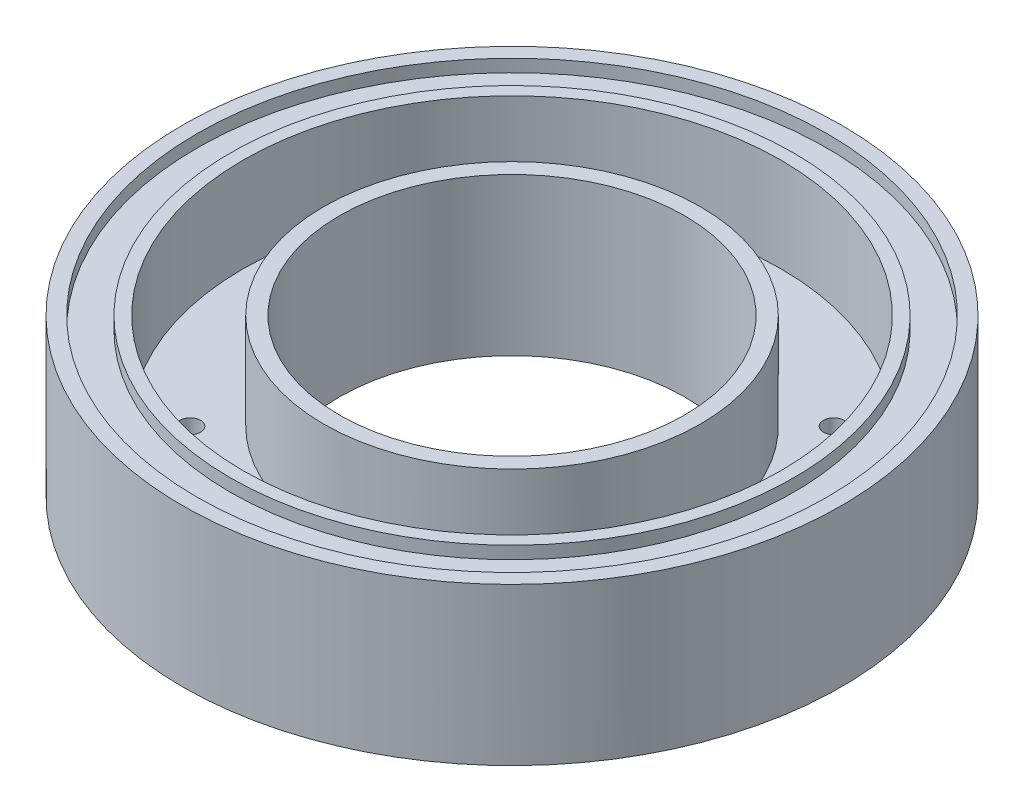
ISO-10303-21;
HEADER;
FILE_DESCRIPTION(('STEP AP214'),'2;1');
FILE_NAME('part.step','',(''),(''),'','','');
FILE_SCHEMA(('AUTOMOTIVE_DESIGN { 1 0 10303 214 1 1 1 1 }'));
ENDSEC;
DATA;
#1=APPLICATION_CONTEXT('core data for automotive mechanical design processes');
#2=APPLICATION_PROTOCOL_DEFINITION('international standard','automotive_design',2000,#1);
#3=PRODUCT_CONTEXT('',#1,'mechanical');
#4=PRODUCT('Part','Part','',(#3));
#5=PRODUCT_RELATED_PRODUCT_CATEGORY('part','',(#4));
#6=PRODUCT_DEFINITION_FORMATION('','',#4);
#7=PRODUCT_DEFINITION_CONTEXT('part definition',#1,'design');
#8=PRODUCT_DEFINITION('design','',#6,#7);
#9=PRODUCT_DEFINITION_SHAPE('','',#8);
#10=(LENGTH_UNIT() NAMED_UNIT(*) SI_UNIT(.MILLI.,.METRE.));
#11=(NAMED_UNIT(*) PLANE_ANGLE_UNIT() SI_UNIT($,.RADIAN.));
#12=(NAMED_UNIT(*) SI_UNIT($,.STERADIAN.) SOLID_ANGLE_UNIT());
#13=UNCERTAINTY_MEASURE_WITH_UNIT(LENGTH_MEASURE(1.E-05),#10,'distance_accuracy_value','');
#14=(GEOMETRIC_REPRESENTATION_CONTEXT(3) GLOBAL_UNCERTAINTY_ASSIGNED_CONTEXT((#13)) GLOBAL_UNIT_ASSIGNED_CONTEXT((#10,
#11,#12)) REPRESENTATION_CONTEXT('',''));
#15=CARTESIAN_POINT('',(0.,0.,0.));
#16=DIRECTION('',(0.,0.,1.));
#17=DIRECTION('',(1.,0.,0.));
#18=AXIS2_PLACEMENT_3D('',#15,#16,#17);
#19=CARTESIAN_POINT('',(-25.635,10.,25.635));
#20=DIRECTION('',(0.,-1.,0.));
#21=DIRECTION('',(0.,0.,-1.));
#22=AXIS2_PLACEMENT_3D('',#19,#20,#21);
#23=CYLINDRICAL_SURFACE('',#22,1.65);
#24=CARTESIAN_POINT('',(-25.635,4.,25.635));
#25=DIRECTION('',(0.,-1.,0.));
#26=DIRECTION('',(0.,0.,-1.));
#27=AXIS2_PLACEMENT_3D('',#24,#25,#26);
#28=CIRCLE('',#27,1.65);
#29=CARTESIAN_POINT('',(-25.635,4.,23.985));
#30=VERTEX_POINT('',#29);
#31=EDGE_CURVE('E115',#30,#30,#28,.F.);
#32=ORIENTED_EDGE('',*,*,#31,.F.);
#33=EDGE_LOOP('',(#32));
#34=FACE_BOUND('',#33,.T.);
#35=CARTESIAN_POINT('',(-25.635,9.7,25.635));
#36=DIRECTION('',(0.,1.,0.));
#37=DIRECTION('',(0.,0.,1.));
#38=AXIS2_PLACEMENT_3D('',#35,#36,#37);
#39=CIRCLE('',#38,1.65);
#40=CARTESIAN_POINT('',(-25.635,9.7,27.285));
#41=VERTEX_POINT('',#40);
#42=EDGE_CURVE('E68',#41,#41,#39,.F.);
#43=ORIENTED_EDGE('',*,*,#42,.F.);
#44=EDGE_LOOP('',(#43));
#45=FACE_BOUND('',#44,.T.);
#46=ADVANCED_FACE('F35',(#34,#45),#23,.F.);
#47=CARTESIAN_POINT('',(25.635,10.,25.635));
#48=DIRECTION('',(0.,-1.,0.));
#49=DIRECTION('',(0.,0.,-1.));
#50=AXIS2_PLACEMENT_3D('',#47,#48,#49);
#51=CYLINDRICAL_SURFACE('',#50,1.65);
#52=CARTESIAN_POINT('',(25.635,4.,25.635));
#53=DIRECTION('',(0.,-1.,0.));
#54=DIRECTION('',(0.,0.,-1.));
#55=AXIS2_PLACEMENT_3D('',#52,#53,#54);
#56=CIRCLE('',#55,1.65);
#57=CARTESIAN_POINT('',(25.635,4.,23.985));
#58=VERTEX_POINT('',#57);
#59=EDGE_CURVE('E127',#58,#58,#56,.F.);
#60=ORIENTED_EDGE('',*,*,#59,.F.);
#61=EDGE_LOOP('',(#60));
#62=FACE_BOUND('',#61,.T.);
#63=CARTESIAN_POINT('',(25.635,9.7,25.635));
#64=DIRECTION('',(0.,1.,0.));
#65=DIRECTION('',(0.,0.,1.));
#66=AXIS2_PLACEMENT_3D('',#63,#64,#65);
#67=CIRCLE('',#66,1.65);
#68=CARTESIAN_POINT('',(25.635,9.7,27.285));
#69=VERTEX_POINT('',#68);
#70=EDGE_CURVE('E65',#69,#69,#67,.F.);
#71=ORIENTED_EDGE('',*,*,#70,.F.);
#72=EDGE_LOOP('',(#71));
#73=FACE_BOUND('',#72,.T.);
#74=ADVANCED_FACE('F160',(#62,#73),#51,.F.);
#75=CARTESIAN_POINT('',(25.635,10.,-25.635));
#76=DIRECTION('',(0.,-1.,0.));
#77=DIRECTION('',(0.,0.,-1.));
#78=AXIS2_PLACEMENT_3D('',#75,#76,#77);
#79=CYLINDRICAL_SURFACE('',#78,1.65);
#80=CARTESIAN_POINT('',(25.635,4.,-25.635));
#81=DIRECTION('',(0.,-1.,0.));
#82=DIRECTION('',(0.,0.,-1.));
#83=AXIS2_PLACEMENT_3D('',#80,#81,#82);
#84=CIRCLE('',#83,1.65);
#85=CARTESIAN_POINT('',(25.635,4.,-27.285));
#86=VERTEX_POINT('',#85);
#87=EDGE_CURVE('E124',#86,#86,#84,.F.);
#88=ORIENTED_EDGE('',*,*,#87,.F.);
#89=EDGE_LOOP('',(#88));
#90=FACE_BOUND('',#89,.T.);
#91=CARTESIAN_POINT('',(25.635,9.7,-25.635));
#92=DIRECTION('',(0.,1.,0.));
#93=DIRECTION('',(0.,0.,1.));
#94=AXIS2_PLACEMENT_3D('',#91,#92,#93);
#95=CIRCLE('',#94,1.65);
#96=CARTESIAN_POINT('',(25.635,9.7,-23.985));
#97=VERTEX_POINT('',#96);
#98=EDGE_CURVE('E62',#97,#97,#95,.F.);
#99=ORIENTED_EDGE('',*,*,#98,.F.);
#100=EDGE_LOOP('',(#99));
#101=FACE_BOUND('',#100,.T.);
#102=ADVANCED_FACE('F166',(#90,#101),#79,.F.);
#103=CARTESIAN_POINT('',(-25.635,10.,-25.635));
#104=DIRECTION('',(0.,-1.,0.));
#105=DIRECTION('',(0.,0.,-1.));
#106=AXIS2_PLACEMENT_3D('',#103,#104,#105);
#107=CYLINDRICAL_SURFACE('',#106,1.65);
#108=CARTESIAN_POINT('',(-25.635,4.,-25.635));
#109=DIRECTION('',(0.,-1.,0.));
#110=DIRECTION('',(0.,0.,-1.));
#111=AXIS2_PLACEMENT_3D('',#108,#109,#110);
#112=CIRCLE('',#111,1.65);
#113=CARTESIAN_POINT('',(-25.635,4.,-27.285));
#114=VERTEX_POINT('',#113);
#115=EDGE_CURVE('E109',#114,#114,#112,.F.);
#116=ORIENTED_EDGE('',*,*,#115,.F.);
#117=EDGE_LOOP('',(#116));
#118=FACE_BOUND('',#117,.T.);
#119=CARTESIAN_POINT('',(-25.635,9.7,-25.635));
#120=DIRECTION('',(0.,1.,0.));
#121=DIRECTION('',(0.,0.,1.));
#122=AXIS2_PLACEMENT_3D('',#119,#120,#121);
#123=CIRCLE('',#122,1.65);
#124=CARTESIAN_POINT('',(-25.635,9.7,-23.985));
#125=VERTEX_POINT('',#124);
#126=EDGE_CURVE('E39',#125,#125,#123,.F.);
#127=ORIENTED_EDGE('',*,*,#126,.F.);
#128=EDGE_LOOP('',(#127));
#129=FACE_BOUND('',#128,.T.);
#130=ADVANCED_FACE('F173',(#118,#129),#107,.F.);
#131=CARTESIAN_POINT('',(0.,30.,0.));
#132=DIRECTION('',(0.,-1.,0.));
#133=DIRECTION('',(0.,0.,-1.));
#134=AXIS2_PLACEMENT_3D('',#131,#132,#133);
#135=CYLINDRICAL_SURFACE('',#134,52.5);
#136=CARTESIAN_POINT('',(0.,25.,0.));
#137=DIRECTION('',(0.,-1.,0.));
#138=DIRECTION('',(0.,0.,-1.));
#139=AXIS2_PLACEMENT_3D('',#136,#137,#138);
#140=CIRCLE('',#139,52.5);
#141=CARTESIAN_POINT('',(0.,25.,-52.5));
#142=VERTEX_POINT('',#141);
#143=EDGE_CURVE('E84',#142,#142,#140,.T.);
#144=ORIENTED_EDGE('',*,*,#143,.T.);
#145=EDGE_LOOP('',(#144));
#146=FACE_BOUND('',#145,.T.);
#147=CARTESIAN_POINT('',(0.,0.,0.));
#148=DIRECTION('',(0.,1.,0.));
#149=DIRECTION('',(0.,0.,1.));
#150=AXIS2_PLACEMENT_3D('',#147,#148,#149);
#151=CIRCLE('',#150,52.5);
#152=CARTESIAN_POINT('',(0.,0.,52.5));
#153=VERTEX_POINT('',#152);
#154=EDGE_CURVE('E11',#153,#153,#151,.T.);
#155=ORIENTED_EDGE('',*,*,#154,.T.);
#156=EDGE_LOOP('',(#155));
#157=FACE_BOUND('',#156,.T.);
#158=ADVANCED_FACE('F37',(#146,#157),#135,.T.);
#159=CARTESIAN_POINT('',(0.,0.,0.));
#160=DIRECTION('',(0.,1.,0.));
#161=DIRECTION('',(0.,0.,1.));
#162=AXIS2_PLACEMENT_3D('',#159,#160,#161);
#163=PLANE('',#162);
#164=CARTESIAN_POINT('',(-25.635,0.,-25.635));
#165=DIRECTION('',(0.,-1.,0.));
#166=DIRECTION('',(0.,0.,-1.));
#167=AXIS2_PLACEMENT_3D('',#164,#165,#166);
#168=CIRCLE('',#167,3.);
#169=CARTESIAN_POINT('',(-25.635,0.,-28.635));
#170=VERTEX_POINT('',#169);
#171=EDGE_CURVE('E87',#170,#170,#168,.T.);
#172=ORIENTED_EDGE('',*,*,#171,.F.);
#173=EDGE_LOOP('',(#172));
#174=FACE_BOUND('',#173,.T.);
#175=CARTESIAN_POINT('',(25.635,0.,-25.635));
#176=DIRECTION('',(0.,-1.,0.));
#177=DIRECTION('',(0.,0.,-1.));
#178=AXIS2_PLACEMENT_3D('',#175,#176,#177);
#179=CIRCLE('',#178,3.);
#180=CARTESIAN_POINT('',(25.635,0.,-28.635));
#181=VERTEX_POINT('',#180);
#182=EDGE_CURVE('E98',#181,#181,#179,.T.);
#183=ORIENTED_EDGE('',*,*,#182,.F.);
#184=EDGE_LOOP('',(#183));
#185=FACE_BOUND('',#184,.T.);
#186=CARTESIAN_POINT('',(25.635,0.,25.635));
#187=DIRECTION('',(0.,-1.,0.));
#188=DIRECTION('',(0.,0.,-1.));
#189=AXIS2_PLACEMENT_3D('',#186,#187,#188);
#190=CIRCLE('',#189,3.);
#191=CARTESIAN_POINT('',(25.635,0.,22.635));
#192=VERTEX_POINT('',#191);
#193=EDGE_CURVE('E92',#192,#192,#190,.T.);
#194=ORIENTED_EDGE('',*,*,#193,.F.);
#195=EDGE_LOOP('',(#194));
#196=FACE_BOUND('',#195,.T.);
#197=CARTESIAN_POINT('',(-25.635,0.,25.635));
#198=DIRECTION('',(0.,-1.,0.));
#199=DIRECTION('',(0.,0.,-1.));
#200=AXIS2_PLACEMENT_3D('',#197,#198,#199);
#201=CIRCLE('',#200,3.);
#202=CARTESIAN_POINT('',(-25.635,0.,22.635));
#203=VERTEX_POINT('',#202);
#204=EDGE_CURVE('E91',#203,#203,#201,.T.);
#205=ORIENTED_EDGE('',*,*,#204,.F.);
#206=EDGE_LOOP('',(#205));
#207=FACE_BOUND('',#206,.T.);
#208=CARTESIAN_POINT('',(0.,0.,0.));
#209=DIRECTION('',(0.,1.,0.));
#210=DIRECTION('',(0.,0.,1.));
#211=AXIS2_PLACEMENT_3D('',#208,#209,#210);
#212=CIRCLE('',#211,27.5);
#213=CARTESIAN_POINT('',(0.,0.,27.5));
#214=VERTEX_POINT('',#213);
#215=EDGE_CURVE('E112',#214,#214,#212,.T.);
#216=ORIENTED_EDGE('',*,*,#215,.T.);
#217=EDGE_LOOP('',(#216));
#218=FACE_BOUND('',#217,.T.);
#219=ORIENTED_EDGE('',*,*,#154,.F.);
#220=EDGE_LOOP('',(#219));
#221=FACE_BOUND('',#220,.T.);
#222=ADVANCED_FACE('F185',(#174,#185,#196,#207,#218,#221),#163,.F.);
#223=CARTESIAN_POINT('',(0.,10.,0.));
#224=DIRECTION('',(0.,1.,0.));
#225=DIRECTION('',(0.,0.,1.));
#226=AXIS2_PLACEMENT_3D('',#223,#224,#225);
#227=CYLINDRICAL_SURFACE('',#226,42.85);
#228=CARTESIAN_POINT('',(0.,25.,0.));
#229=DIRECTION('',(0.,-1.,0.));
#230=DIRECTION('',(0.,0.,-1.));
#231=AXIS2_PLACEMENT_3D('',#228,#229,#230);
#232=CIRCLE('',#231,42.85);
#233=CARTESIAN_POINT('',(0.,25.,-42.85));
#234=VERTEX_POINT('',#233);
#235=EDGE_CURVE('E75',#234,#234,#232,.F.);
#236=ORIENTED_EDGE('',*,*,#235,.T.);
#237=EDGE_LOOP('',(#236));
#238=FACE_BOUND('',#237,.T.);
#239=CARTESIAN_POINT('',(0.,10.,0.));
#240=DIRECTION('',(0.,1.,0.));
#241=DIRECTION('',(0.,0.,1.));
#242=AXIS2_PLACEMENT_3D('',#239,#240,#241);
#243=CIRCLE('',#242,42.85);
#244=CARTESIAN_POINT('',(42.85,10.,0.));
#245=VERTEX_POINT('',#244);
#246=EDGE_CURVE('E52',#245,#245,#243,.T.);
#247=ORIENTED_EDGE('',*,*,#246,.F.);
#248=EDGE_LOOP('',(#247));
#249=FACE_BOUND('',#248,.T.);
#250=ADVANCED_FACE('F181',(#238,#249),#227,.F.);
#251=CARTESIAN_POINT('',(0.,10.,0.));
#252=DIRECTION('',(0.,1.,0.));
#253=DIRECTION('',(0.,0.,1.));
#254=AXIS2_PLACEMENT_3D('',#251,#252,#253);
#255=CYLINDRICAL_SURFACE('',#254,30.);
#256=CARTESIAN_POINT('',(0.,25.,0.));
#257=DIRECTION('',(0.,-1.,0.));
#258=DIRECTION('',(0.,0.,-1.));
#259=AXIS2_PLACEMENT_3D('',#256,#257,#258);
#260=CIRCLE('',#259,30.);
#261=CARTESIAN_POINT('',(0.,25.,-30.));
#262=VERTEX_POINT('',#261);
#263=EDGE_CURVE('E72',#262,#262,#260,.F.);
#264=ORIENTED_EDGE('',*,*,#263,.F.);
#265=EDGE_LOOP('',(#264));
#266=FACE_BOUND('',#265,.T.);
#267=CARTESIAN_POINT('',(0.,9.7,0.));
#268=DIRECTION('',(0.,1.,0.));
#269=DIRECTION('',(0.,0.,1.));
#270=AXIS2_PLACEMENT_3D('',#267,#268,#269);
#271=CIRCLE('',#270,30.);
#272=CARTESIAN_POINT('',(0.,9.7,30.));
#273=VERTEX_POINT('',#272);
#274=EDGE_CURVE('E55',#273,#273,#271,.T.);
#275=ORIENTED_EDGE('',*,*,#274,.T.);
#276=EDGE_LOOP('',(#275));
#277=FACE_BOUND('',#276,.T.);
#278=ADVANCED_FACE('F178',(#266,#277),#255,.T.);
#279=CARTESIAN_POINT('',(0.,0.,0.));
#280=DIRECTION('',(0.,1.,0.));
#281=DIRECTION('',(0.,0.,1.));
#282=AXIS2_PLACEMENT_3D('',#279,#280,#281);
#283=CYLINDRICAL_SURFACE('',#282,27.5);
#284=CARTESIAN_POINT('',(0.,25.,0.));
#285=DIRECTION('',(0.,-1.,0.));
#286=DIRECTION('',(0.,0.,-1.));
#287=AXIS2_PLACEMENT_3D('',#284,#285,#286);
#288=CIRCLE('',#287,27.5);
#289=CARTESIAN_POINT('',(0.,25.,-27.5));
#290=VERTEX_POINT('',#289);
#291=EDGE_CURVE('E71',#290,#290,#288,.F.);
#292=ORIENTED_EDGE('',*,*,#291,.T.);
#293=EDGE_LOOP('',(#292));
#294=FACE_BOUND('',#293,.T.);
#295=ORIENTED_EDGE('',*,*,#215,.F.);
#296=EDGE_LOOP('',(#295));
#297=FACE_BOUND('',#296,.T.);
#298=ADVANCED_FACE('F134',(#294,#297),#283,.F.);
#299=CARTESIAN_POINT('',(-25.635,4.,-25.635));
#300=DIRECTION('',(0.,-1.,0.));
#301=DIRECTION('',(0.,0.,-1.));
#302=AXIS2_PLACEMENT_3D('',#299,#300,#301);
#303=PLANE('',#302);
#304=CARTESIAN_POINT('',(-25.635,4.,-25.635));
#305=DIRECTION('',(0.,-1.,0.));
#306=DIRECTION('',(0.,0.,-1.));
#307=AXIS2_PLACEMENT_3D('',#304,#305,#306);
#308=CIRCLE('',#307,3.);
#309=CARTESIAN_POINT('',(-25.635,4.,-28.635));
#310=VERTEX_POINT('',#309);
#311=EDGE_CURVE('E101',#310,#310,#308,.T.);
#312=ORIENTED_EDGE('',*,*,#311,.T.);
#313=EDGE_LOOP('',(#312));
#314=FACE_BOUND('',#313,.T.);
#315=ORIENTED_EDGE('',*,*,#115,.T.);
#316=EDGE_LOOP('',(#315));
#317=FACE_BOUND('',#316,.T.);
#318=ADVANCED_FACE('F177',(#314,#317),#303,.T.);
#319=CARTESIAN_POINT('',(-25.635,4.,-25.635));
#320=DIRECTION('',(0.,-1.,0.));
#321=DIRECTION('',(0.,0.,-1.));
#322=AXIS2_PLACEMENT_3D('',#319,#320,#321);
#323=CYLINDRICAL_SURFACE('',#322,3.);
#324=ORIENTED_EDGE('',*,*,#311,.F.);
#325=EDGE_LOOP('',(#324));
#326=FACE_BOUND('',#325,.T.);
#327=ORIENTED_EDGE('',*,*,#171,.T.);
#328=EDGE_LOOP('',(#327));
#329=FACE_BOUND('',#328,.T.);
#330=ADVANCED_FACE('F234',(#326,#329),#323,.F.);
#331=CARTESIAN_POINT('',(25.635,4.,-25.635));
#332=DIRECTION('',(0.,-1.,0.));
#333=DIRECTION('',(0.,0.,-1.));
#334=AXIS2_PLACEMENT_3D('',#331,#332,#333);
#335=PLANE('',#334);
#336=CARTESIAN_POINT('',(25.635,4.,-25.635));
#337=DIRECTION('',(0.,-1.,0.));
#338=DIRECTION('',(0.,0.,-1.));
#339=AXIS2_PLACEMENT_3D('',#336,#337,#338);
#340=CIRCLE('',#339,3.);
#341=CARTESIAN_POINT('',(25.635,4.,-28.635));
#342=VERTEX_POINT('',#341);
#343=EDGE_CURVE('E95',#342,#342,#340,.T.);
#344=ORIENTED_EDGE('',*,*,#343,.T.);
#345=EDGE_LOOP('',(#344));
#346=FACE_BOUND('',#345,.T.);
#347=ORIENTED_EDGE('',*,*,#87,.T.);
#348=EDGE_LOOP('',(#347));
#349=FACE_BOUND('',#348,.T.);
#350=ADVANCED_FACE('F231',(#346,#349),#335,.T.);
#351=CARTESIAN_POINT('',(25.635,4.,-25.635));
#352=DIRECTION('',(0.,-1.,0.));
#353=DIRECTION('',(0.,0.,-1.));
#354=AXIS2_PLACEMENT_3D('',#351,#352,#353);
#355=CYLINDRICAL_SURFACE('',#354,3.);
#356=ORIENTED_EDGE('',*,*,#343,.F.);
#357=EDGE_LOOP('',(#356));
#358=FACE_BOUND('',#357,.T.);
#359=ORIENTED_EDGE('',*,*,#182,.T.);
#360=EDGE_LOOP('',(#359));
#361=FACE_BOUND('',#360,.T.);
#362=ADVANCED_FACE('F227',(#358,#361),#355,.F.);
#363=CARTESIAN_POINT('',(25.635,4.,25.635));
#364=DIRECTION('',(0.,-1.,0.));
#365=DIRECTION('',(0.,0.,-1.));
#366=AXIS2_PLACEMENT_3D('',#363,#364,#365);
#367=PLANE('',#366);
#368=CARTESIAN_POINT('',(25.635,4.,25.635));
#369=DIRECTION('',(0.,-1.,0.));
#370=DIRECTION('',(0.,0.,-1.));
#371=AXIS2_PLACEMENT_3D('',#368,#369,#370);
#372=CIRCLE('',#371,3.);
#373=CARTESIAN_POINT('',(25.635,4.,22.635));
#374=VERTEX_POINT('',#373);
#375=EDGE_CURVE('E88',#374,#374,#372,.T.);
#376=ORIENTED_EDGE('',*,*,#375,.T.);
#377=EDGE_LOOP('',(#376));
#378=FACE_BOUND('',#377,.T.);
#379=ORIENTED_EDGE('',*,*,#59,.T.);
#380=EDGE_LOOP('',(#379));
#381=FACE_BOUND('',#380,.T.);
#382=ADVANCED_FACE('F218',(#378,#381),#367,.T.);
#383=CARTESIAN_POINT('',(25.635,4.,25.635));
#384=DIRECTION('',(0.,-1.,0.));
#385=DIRECTION('',(0.,0.,-1.));
#386=AXIS2_PLACEMENT_3D('',#383,#384,#385);
#387=CYLINDRICAL_SURFACE('',#386,3.);
#388=ORIENTED_EDGE('',*,*,#375,.F.);
#389=EDGE_LOOP('',(#388));
#390=FACE_BOUND('',#389,.T.);
#391=ORIENTED_EDGE('',*,*,#193,.T.);
#392=EDGE_LOOP('',(#391));
#393=FACE_BOUND('',#392,.T.);
#394=ADVANCED_FACE('F216',(#390,#393),#387,.F.);
#395=CARTESIAN_POINT('',(-25.635,4.,25.635));
#396=DIRECTION('',(0.,-1.,0.));
#397=DIRECTION('',(0.,0.,-1.));
#398=AXIS2_PLACEMENT_3D('',#395,#396,#397);
#399=PLANE('',#398);
#400=CARTESIAN_POINT('',(-25.635,4.,25.635));
#401=DIRECTION('',(0.,-1.,0.));
#402=DIRECTION('',(0.,0.,-1.));
#403=AXIS2_PLACEMENT_3D('',#400,#401,#402);
#404=CIRCLE('',#403,3.);
#405=CARTESIAN_POINT('',(-25.635,4.,22.635));
#406=VERTEX_POINT('',#405);
#407=EDGE_CURVE('E106',#406,#406,#404,.T.);
#408=ORIENTED_EDGE('',*,*,#407,.T.);
#409=EDGE_LOOP('',(#408));
#410=FACE_BOUND('',#409,.T.);
#411=ORIENTED_EDGE('',*,*,#31,.T.);
#412=EDGE_LOOP('',(#411));
#413=FACE_BOUND('',#412,.T.);
#414=ADVANCED_FACE('F150',(#410,#413),#399,.T.);
#415=CARTESIAN_POINT('',(-25.635,4.,25.635));
#416=DIRECTION('',(0.,-1.,0.));
#417=DIRECTION('',(0.,0.,-1.));
#418=AXIS2_PLACEMENT_3D('',#415,#416,#417);
#419=CYLINDRICAL_SURFACE('',#418,3.);
#420=ORIENTED_EDGE('',*,*,#407,.F.);
#421=EDGE_LOOP('',(#420));
#422=FACE_BOUND('',#421,.T.);
#423=ORIENTED_EDGE('',*,*,#204,.T.);
#424=EDGE_LOOP('',(#423));
#425=FACE_BOUND('',#424,.T.);
#426=ADVANCED_FACE('F140',(#422,#425),#419,.F.);
#427=CARTESIAN_POINT('',(0.,25.,0.));
#428=DIRECTION('',(0.,-1.,0.));
#429=DIRECTION('',(0.,0.,-1.));
#430=AXIS2_PLACEMENT_3D('',#427,#428,#429);
#431=PLANE('',#430);
#432=ORIENTED_EDGE('',*,*,#263,.T.);
#433=EDGE_LOOP('',(#432));
#434=FACE_BOUND('',#433,.T.);
#435=ORIENTED_EDGE('',*,*,#291,.F.);
#436=EDGE_LOOP('',(#435));
#437=FACE_BOUND('',#436,.T.);
#438=ADVANCED_FACE('F137',(#434,#437),#431,.F.);
#439=CARTESIAN_POINT('',(0.,25.,0.));
#440=DIRECTION('',(0.,-1.,0.));
#441=DIRECTION('',(0.,0.,-1.));
#442=AXIS2_PLACEMENT_3D('',#439,#440,#441);
#443=CIRCLE('',#442,44.85);
#444=CARTESIAN_POINT('',(0.,25.,-44.85));
#445=VERTEX_POINT('',#444);
#446=EDGE_CURVE('E78',#445,#445,#443,.F.);
#447=ORIENTED_EDGE('',*,*,#446,.T.);
#448=EDGE_LOOP('',(#447));
#449=FACE_BOUND('',#448,.T.);
#450=ORIENTED_EDGE('',*,*,#235,.F.);
#451=EDGE_LOOP('',(#450));
#452=FACE_BOUND('',#451,.T.);
#453=ADVANCED_FACE('F139',(#449,#452),#431,.F.);
#454=CARTESIAN_POINT('',(0.,23.,0.));
#455=DIRECTION('',(0.,1.,0.));
#456=DIRECTION('',(0.,0.,1.));
#457=AXIS2_PLACEMENT_3D('',#454,#455,#456);
#458=CYLINDRICAL_SURFACE('',#457,50.175);
#459=CARTESIAN_POINT('',(0.,25.,0.));
#460=DIRECTION('',(0.,-1.,0.));
#461=DIRECTION('',(0.,0.,-1.));
#462=AXIS2_PLACEMENT_3D('',#459,#460,#461);
#463=CIRCLE('',#462,50.175);
#464=CARTESIAN_POINT('',(0.,25.,-50.175));
#465=VERTEX_POINT('',#464);
#466=EDGE_CURVE('E81',#465,#465,#463,.F.);
#467=ORIENTED_EDGE('',*,*,#466,.T.);
#468=EDGE_LOOP('',(#467));
#469=FACE_BOUND('',#468,.T.);
#470=CARTESIAN_POINT('',(0.,23.,0.));
#471=DIRECTION('',(0.,1.,0.));
#472=DIRECTION('',(0.,0.,1.));
#473=AXIS2_PLACEMENT_3D('',#470,#471,#472);
#474=CIRCLE('',#473,50.175);
#475=CARTESIAN_POINT('',(0.,23.,50.175));
#476=VERTEX_POINT('',#475);
#477=EDGE_CURVE('E43',#476,#476,#474,.T.);
#478=ORIENTED_EDGE('',*,*,#477,.F.);
#479=EDGE_LOOP('',(#478));
#480=FACE_BOUND('',#479,.T.);
#481=ADVANCED_FACE('F148',(#469,#480),#458,.F.);
#482=CARTESIAN_POINT('',(0.,23.,0.));
#483=DIRECTION('',(0.,1.,0.));
#484=DIRECTION('',(0.,0.,1.));
#485=AXIS2_PLACEMENT_3D('',#482,#483,#484);
#486=PLANE('',#485);
#487=CARTESIAN_POINT('',(0.,23.,0.));
#488=DIRECTION('',(0.,1.,0.));
#489=DIRECTION('',(0.,0.,1.));
#490=AXIS2_PLACEMENT_3D('',#487,#488,#489);
#491=CIRCLE('',#490,44.85);
#492=CARTESIAN_POINT('',(0.,23.,44.85));
#493=VERTEX_POINT('',#492);
#494=EDGE_CURVE('E117',#493,#493,#491,.T.);
#495=ORIENTED_EDGE('',*,*,#494,.F.);
#496=EDGE_LOOP('',(#495));
#497=FACE_BOUND('',#496,.T.);
#498=ORIENTED_EDGE('',*,*,#477,.T.);
#499=EDGE_LOOP('',(#498));
#500=FACE_BOUND('',#499,.T.);
#501=ADVANCED_FACE('F189',(#497,#500),#486,.T.);
#502=CARTESIAN_POINT('',(0.,23.,0.));
#503=DIRECTION('',(0.,1.,0.));
#504=DIRECTION('',(0.,0.,1.));
#505=AXIS2_PLACEMENT_3D('',#502,#503,#504);
#506=CYLINDRICAL_SURFACE('',#505,44.85);
#507=ORIENTED_EDGE('',*,*,#446,.F.);
#508=EDGE_LOOP('',(#507));
#509=FACE_BOUND('',#508,.T.);
#510=ORIENTED_EDGE('',*,*,#494,.T.);
#511=EDGE_LOOP('',(#510));
#512=FACE_BOUND('',#511,.T.);
#513=ADVANCED_FACE('F157',(#509,#512),#506,.T.);
#514=ORIENTED_EDGE('',*,*,#466,.F.);
#515=EDGE_LOOP('',(#514));
#516=FACE_BOUND('',#515,.T.);
#517=ORIENTED_EDGE('',*,*,#143,.F.);
#518=EDGE_LOOP('',(#517));
#519=FACE_BOUND('',#518,.T.);
#520=ADVANCED_FACE('F143',(#516,#519),#431,.F.);
#521=CARTESIAN_POINT('',(-0.591303223064527,9.7,0.));
#522=DIRECTION('',(0.,1.,0.));
#523=DIRECTION('',(0.,0.,1.));
#524=AXIS2_PLACEMENT_3D('',#521,#522,#523);
#525=PLANE('',#524);
#526=ORIENTED_EDGE('',*,*,#274,.F.);
#527=EDGE_LOOP('',(#526));
#528=FACE_BOUND('',#527,.T.);
#529=CARTESIAN_POINT('',(-0.591303223064527,9.7,0.));
#530=DIRECTION('',(0.,1.,0.));
#531=DIRECTION('',(0.,0.,1.));
#532=AXIS2_PLACEMENT_3D('',#529,#530,#531);
#533=CIRCLE('',#532,43.4413032230645);
#534=CARTESIAN_POINT('',(-0.591303223064527,9.7,43.4413032230645));
#535=VERTEX_POINT('',#534);
#536=EDGE_CURVE('E54',#535,#535,#533,.T.);
#537=ORIENTED_EDGE('',*,*,#536,.T.);
#538=EDGE_LOOP('',(#537));
#539=FACE_BOUND('',#538,.T.);
#540=ORIENTED_EDGE('',*,*,#126,.T.);
#541=EDGE_LOOP('',(#540));
#542=FACE_BOUND('',#541,.T.);
#543=ORIENTED_EDGE('',*,*,#98,.T.);
#544=EDGE_LOOP('',(#543));
#545=FACE_BOUND('',#544,.T.);
#546=ORIENTED_EDGE('',*,*,#70,.T.);
#547=EDGE_LOOP('',(#546));
#548=FACE_BOUND('',#547,.T.);
#549=ORIENTED_EDGE('',*,*,#42,.T.);
#550=EDGE_LOOP('',(#549));
#551=FACE_BOUND('',#550,.T.);
#552=ADVANCED_FACE('F156',(#528,#539,#542,#545,#548,#551),#525,.T.);
#553=CARTESIAN_POINT('',(-0.591303223064527,10.,0.));
#554=DIRECTION('',(0.,1.,0.));
#555=DIRECTION('',(0.,0.,1.));
#556=AXIS2_PLACEMENT_3D('',#553,#554,#555);
#557=PLANE('',#556);
#558=CARTESIAN_POINT('',(-0.591303223064527,10.,0.));
#559=DIRECTION('',(0.,1.,0.));
#560=DIRECTION('',(0.,0.,1.));
#561=AXIS2_PLACEMENT_3D('',#558,#559,#560);
#562=CIRCLE('',#561,43.4413032230645);
#563=EDGE_CURVE('E49',#245,#245,#562,.T.);
#564=ORIENTED_EDGE('',*,*,#563,.F.);
#565=ORIENTED_EDGE('',*,*,#246,.T.);
#566=EDGE_LOOP('',(#564,#565));
#567=FACE_BOUND('',#566,.T.);
#568=ADVANCED_FACE('F50',(#567),#557,.F.);
#569=CARTESIAN_POINT('',(-0.591303223064527,9.7,0.));
#570=DIRECTION('',(0.,1.,0.));
#571=DIRECTION('',(0.,0.,1.));
#572=AXIS2_PLACEMENT_3D('',#569,#570,#571);
#573=CYLINDRICAL_SURFACE('',#572,43.4413032230645);
#574=ORIENTED_EDGE('',*,*,#536,.F.);
#575=EDGE_LOOP('',(#574));
#576=FACE_BOUND('',#575,.T.);
#577=ORIENTED_EDGE('',*,*,#563,.T.);
#578=EDGE_LOOP('',(#577));
#579=FACE_BOUND('',#578,.T.);
#580=ADVANCED_FACE('F265',(#576,#579),#573,.F.);
#581=CLOSED_SHELL('',(#46,#74,#102,#130,#158,#222,#250,#278,#298,#318,#330,#350,#362,#382,#394,
#414,#426,#438,#453,#481,#501,#513,#520,#552,#568,#580));
#582=MANIFOLD_SOLID_BREP('B2',#581);
#583=ADVANCED_BREP_SHAPE_REPRESENTATION('',(#18,#582),#14);
#584=SHAPE_DEFINITION_REPRESENTATION(#9,#583);
ENDSEC;
END-ISO-10303-21;
